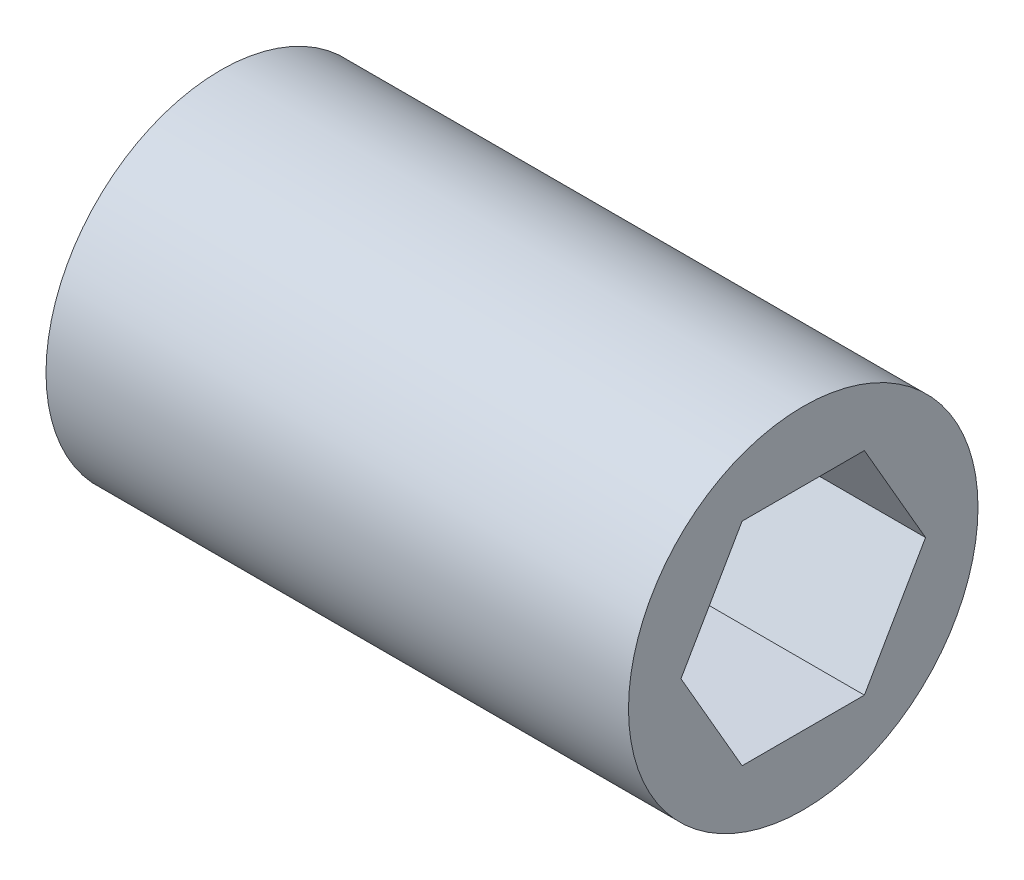
ISO-10303-21;
HEADER;
FILE_DESCRIPTION(('STEP AP214'),'2;1');
FILE_NAME('part.step','',(''),(''),'','','');
FILE_SCHEMA(('AUTOMOTIVE_DESIGN { 1 0 10303 214 1 1 1 1 }'));
ENDSEC;
DATA;
#1=APPLICATION_CONTEXT('core data for automotive mechanical design processes');
#2=APPLICATION_PROTOCOL_DEFINITION('international standard','automotive_design',2000,#1);
#3=PRODUCT_CONTEXT('',#1,'mechanical');
#4=PRODUCT('Part','Part','',(#3));
#5=PRODUCT_RELATED_PRODUCT_CATEGORY('part','',(#4));
#6=PRODUCT_DEFINITION_FORMATION('','',#4);
#7=PRODUCT_DEFINITION_CONTEXT('part definition',#1,'design');
#8=PRODUCT_DEFINITION('design','',#6,#7);
#9=PRODUCT_DEFINITION_SHAPE('','',#8);
#10=(LENGTH_UNIT() NAMED_UNIT(*) SI_UNIT(.MILLI.,.METRE.));
#11=(NAMED_UNIT(*) PLANE_ANGLE_UNIT() SI_UNIT($,.RADIAN.));
#12=(NAMED_UNIT(*) SI_UNIT($,.STERADIAN.) SOLID_ANGLE_UNIT());
#13=UNCERTAINTY_MEASURE_WITH_UNIT(LENGTH_MEASURE(1.E-05),#10,'distance_accuracy_value','');
#14=(GEOMETRIC_REPRESENTATION_CONTEXT(3) GLOBAL_UNCERTAINTY_ASSIGNED_CONTEXT((#13)) GLOBAL_UNIT_ASSIGNED_CONTEXT((#10,
#11,#12)) REPRESENTATION_CONTEXT('',''));
#15=CARTESIAN_POINT('',(0.,0.,0.));
#16=DIRECTION('',(0.,0.,1.));
#17=DIRECTION('',(1.,0.,0.));
#18=AXIS2_PLACEMENT_3D('',#15,#16,#17);
#19=CARTESIAN_POINT('',(17.4625,0.,0.));
#20=DIRECTION('',(1.,0.,0.));
#21=DIRECTION('',(0.,0.,-1.));
#22=AXIS2_PLACEMENT_3D('',#19,#20,#21);
#23=PLANE('',#22);
#24=CARTESIAN_POINT('',(17.4625,0.,0.));
#25=DIRECTION('',(1.,0.,0.));
#26=DIRECTION('',(0.,0.,-1.));
#27=AXIS2_PLACEMENT_3D('',#24,#25,#26);
#28=CIRCLE('',#27,10.4775);
#29=CARTESIAN_POINT('',(17.4625,0.,-10.4775));
#30=VERTEX_POINT('',#29);
#31=EDGE_CURVE('E11',#30,#30,#28,.T.);
#32=ORIENTED_EDGE('',*,*,#31,.T.);
#33=EDGE_LOOP('',(#32));
#34=FACE_BOUND('',#33,.T.);
#35=DIRECTION('',(0.,0.,1.));
#36=VECTOR('',#35,1.);
#37=CARTESIAN_POINT('',(17.4625,6.35,-3.66617420935412));
#38=LINE('',#37,#36);
#39=CARTESIAN_POINT('',(17.4625,6.35,-3.66617420935412));
#40=VERTEX_POINT('',#39);
#41=CARTESIAN_POINT('',(17.4625,6.35,3.66617420935412));
#42=VERTEX_POINT('',#41);
#43=EDGE_CURVE('E95',#40,#42,#38,.T.);
#44=ORIENTED_EDGE('',*,*,#43,.F.);
#45=DIRECTION('',(0.,0.866025403784438,0.5));
#46=VECTOR('',#45,1.);
#47=CARTESIAN_POINT('',(17.4625,0.,-7.33234841870825));
#48=LINE('',#47,#46);
#49=CARTESIAN_POINT('',(17.4625,0.,-7.33234841870825));
#50=VERTEX_POINT('',#49);
#51=EDGE_CURVE('E87',#50,#40,#48,.T.);
#52=ORIENTED_EDGE('',*,*,#51,.F.);
#53=DIRECTION('',(0.,0.866025403784439,-0.5));
#54=VECTOR('',#53,1.);
#55=CARTESIAN_POINT('',(17.4625,-6.35,-3.66617420935412));
#56=LINE('',#55,#54);
#57=CARTESIAN_POINT('',(17.4625,-6.35,-3.66617420935413));
#58=VERTEX_POINT('',#57);
#59=EDGE_CURVE('E115',#58,#50,#56,.T.);
#60=ORIENTED_EDGE('',*,*,#59,.F.);
#61=DIRECTION('',(0.,0.,-1.));
#62=VECTOR('',#61,1.);
#63=CARTESIAN_POINT('',(17.4625,-6.35,3.66617420935412));
#64=LINE('',#63,#62);
#65=CARTESIAN_POINT('',(17.4625,-6.35,3.66617420935412));
#66=VERTEX_POINT('',#65);
#67=EDGE_CURVE('E113',#66,#58,#64,.T.);
#68=ORIENTED_EDGE('',*,*,#67,.F.);
#69=DIRECTION('',(0.,-0.866025403784438,-0.500000000000001));
#70=VECTOR('',#69,1.);
#71=CARTESIAN_POINT('',(17.4625,0.,7.33234841870824));
#72=LINE('',#71,#70);
#73=CARTESIAN_POINT('',(17.4625,0.,7.33234841870824));
#74=VERTEX_POINT('',#73);
#75=EDGE_CURVE('E109',#74,#66,#72,.T.);
#76=ORIENTED_EDGE('',*,*,#75,.F.);
#77=DIRECTION('',(0.,-0.866025403784439,0.5));
#78=VECTOR('',#77,1.);
#79=CARTESIAN_POINT('',(17.4625,6.35,3.66617420935412));
#80=LINE('',#79,#78);
#81=EDGE_CURVE('E107',#42,#74,#80,.T.);
#82=ORIENTED_EDGE('',*,*,#81,.F.);
#83=EDGE_LOOP('',(#44,#52,#60,#68,#76,#82));
#84=FACE_BOUND('',#83,.T.);
#85=ADVANCED_FACE('F34',(#34,#84),#23,.T.);
#86=CARTESIAN_POINT('',(-17.4625,0.,0.));
#87=DIRECTION('',(1.,0.,0.));
#88=DIRECTION('',(0.,0.,-1.));
#89=AXIS2_PLACEMENT_3D('',#86,#87,#88);
#90=PLANE('',#89);
#91=CARTESIAN_POINT('',(-17.4625,0.,0.));
#92=DIRECTION('',(1.,0.,0.));
#93=DIRECTION('',(0.,0.,-1.));
#94=AXIS2_PLACEMENT_3D('',#91,#92,#93);
#95=CIRCLE('',#94,10.4775);
#96=CARTESIAN_POINT('',(-17.4625,0.,-10.4775));
#97=VERTEX_POINT('',#96);
#98=EDGE_CURVE('E38',#97,#97,#95,.T.);
#99=ORIENTED_EDGE('',*,*,#98,.F.);
#100=EDGE_LOOP('',(#99));
#101=FACE_BOUND('',#100,.T.);
#102=DIRECTION('',(0.,0.866025403784438,0.5));
#103=VECTOR('',#102,1.);
#104=CARTESIAN_POINT('',(-17.4625,0.,-7.33234841870825));
#105=LINE('',#104,#103);
#106=CARTESIAN_POINT('',(-17.4625,0.,-7.33234841870824));
#107=VERTEX_POINT('',#106);
#108=CARTESIAN_POINT('',(-17.4625,6.35,-3.66617420935412));
#109=VERTEX_POINT('',#108);
#110=EDGE_CURVE('E57',#107,#109,#105,.T.);
#111=ORIENTED_EDGE('',*,*,#110,.T.);
#112=DIRECTION('',(0.,0.,1.));
#113=VECTOR('',#112,1.);
#114=CARTESIAN_POINT('',(-17.4625,6.35,-3.66617420935412));
#115=LINE('',#114,#113);
#116=CARTESIAN_POINT('',(-17.4625,6.35,3.66617420935412));
#117=VERTEX_POINT('',#116);
#118=EDGE_CURVE('E102',#109,#117,#115,.T.);
#119=ORIENTED_EDGE('',*,*,#118,.T.);
#120=DIRECTION('',(0.,-0.866025403784439,0.5));
#121=VECTOR('',#120,1.);
#122=CARTESIAN_POINT('',(-17.4625,6.35,3.66617420935412));
#123=LINE('',#122,#121);
#124=CARTESIAN_POINT('',(-17.4625,0.,7.33234841870824));
#125=VERTEX_POINT('',#124);
#126=EDGE_CURVE('E119',#117,#125,#123,.T.);
#127=ORIENTED_EDGE('',*,*,#126,.T.);
#128=DIRECTION('',(0.,-0.866025403784438,-0.500000000000001));
#129=VECTOR('',#128,1.);
#130=CARTESIAN_POINT('',(-17.4625,0.,7.33234841870824));
#131=LINE('',#130,#129);
#132=CARTESIAN_POINT('',(-17.4625,-6.35,3.66617420935412));
#133=VERTEX_POINT('',#132);
#134=EDGE_CURVE('E122',#125,#133,#131,.T.);
#135=ORIENTED_EDGE('',*,*,#134,.T.);
#136=DIRECTION('',(0.,0.,-1.));
#137=VECTOR('',#136,1.);
#138=CARTESIAN_POINT('',(-17.4625,-6.35,3.66617420935412));
#139=LINE('',#138,#137);
#140=CARTESIAN_POINT('',(-17.4625,-6.35,-3.66617420935412));
#141=VERTEX_POINT('',#140);
#142=EDGE_CURVE('E125',#133,#141,#139,.T.);
#143=ORIENTED_EDGE('',*,*,#142,.T.);
#144=DIRECTION('',(0.,0.866025403784439,-0.5));
#145=VECTOR('',#144,1.);
#146=CARTESIAN_POINT('',(-17.4625,-6.35,-3.66617420935412));
#147=LINE('',#146,#145);
#148=EDGE_CURVE('E96',#141,#107,#147,.T.);
#149=ORIENTED_EDGE('',*,*,#148,.T.);
#150=EDGE_LOOP('',(#111,#119,#127,#135,#143,#149));
#151=FACE_BOUND('',#150,.T.);
#152=ADVANCED_FACE('F142',(#101,#151),#90,.F.);
#153=CARTESIAN_POINT('',(17.4625,0.,0.));
#154=DIRECTION('',(-1.,0.,0.));
#155=DIRECTION('',(0.,0.,1.));
#156=AXIS2_PLACEMENT_3D('',#153,#154,#155);
#157=CYLINDRICAL_SURFACE('',#156,10.4775);
#158=ORIENTED_EDGE('',*,*,#31,.F.);
#159=EDGE_LOOP('',(#158));
#160=FACE_BOUND('',#159,.T.);
#161=ORIENTED_EDGE('',*,*,#98,.T.);
#162=EDGE_LOOP('',(#161));
#163=FACE_BOUND('',#162,.T.);
#164=ADVANCED_FACE('F36',(#160,#163),#157,.T.);
#165=CARTESIAN_POINT('',(17.4625,0.,-7.33234841870825));
#166=DIRECTION('',(0.,-0.5,0.866025403784438));
#167=DIRECTION('',(0.,-0.866025403784438,-0.5));
#168=AXIS2_PLACEMENT_3D('',#165,#166,#167);
#169=PLANE('',#168);
#170=ORIENTED_EDGE('',*,*,#110,.F.);
#171=DIRECTION('',(-1.,0.,0.));
#172=VECTOR('',#171,1.);
#173=CARTESIAN_POINT('',(17.4625,0.,-7.33234841870825));
#174=LINE('',#173,#172);
#175=EDGE_CURVE('E91',#50,#107,#174,.T.);
#176=ORIENTED_EDGE('',*,*,#175,.F.);
#177=ORIENTED_EDGE('',*,*,#51,.T.);
#178=DIRECTION('',(-1.,0.,0.));
#179=VECTOR('',#178,1.);
#180=CARTESIAN_POINT('',(17.4625,6.35,-3.66617420935412));
#181=LINE('',#180,#179);
#182=EDGE_CURVE('E90',#40,#109,#181,.T.);
#183=ORIENTED_EDGE('',*,*,#182,.T.);
#184=EDGE_LOOP('',(#170,#176,#177,#183));
#185=FACE_BOUND('',#184,.T.);
#186=ADVANCED_FACE('F89',(#185),#169,.T.);
#187=CARTESIAN_POINT('',(17.4625,6.35,-3.66617420935412));
#188=DIRECTION('',(0.,-1.,0.));
#189=DIRECTION('',(0.,0.,-1.));
#190=AXIS2_PLACEMENT_3D('',#187,#188,#189);
#191=PLANE('',#190);
#192=ORIENTED_EDGE('',*,*,#118,.F.);
#193=ORIENTED_EDGE('',*,*,#182,.F.);
#194=ORIENTED_EDGE('',*,*,#43,.T.);
#195=DIRECTION('',(-1.,0.,0.));
#196=VECTOR('',#195,1.);
#197=CARTESIAN_POINT('',(17.4625,6.35,3.66617420935412));
#198=LINE('',#197,#196);
#199=EDGE_CURVE('E103',#42,#117,#198,.T.);
#200=ORIENTED_EDGE('',*,*,#199,.T.);
#201=EDGE_LOOP('',(#192,#193,#194,#200));
#202=FACE_BOUND('',#201,.T.);
#203=ADVANCED_FACE('F99',(#202),#191,.T.);
#204=CARTESIAN_POINT('',(17.4625,6.35,3.66617420935412));
#205=DIRECTION('',(0.,-0.5,-0.866025403784439));
#206=DIRECTION('',(0.,0.866025403784439,-0.5));
#207=AXIS2_PLACEMENT_3D('',#204,#205,#206);
#208=PLANE('',#207);
#209=ORIENTED_EDGE('',*,*,#126,.F.);
#210=ORIENTED_EDGE('',*,*,#199,.F.);
#211=ORIENTED_EDGE('',*,*,#81,.T.);
#212=DIRECTION('',(-1.,0.,0.));
#213=VECTOR('',#212,1.);
#214=CARTESIAN_POINT('',(17.4625,0.,7.33234841870824));
#215=LINE('',#214,#213);
#216=EDGE_CURVE('E134',#74,#125,#215,.T.);
#217=ORIENTED_EDGE('',*,*,#216,.T.);
#218=EDGE_LOOP('',(#209,#210,#211,#217));
#219=FACE_BOUND('',#218,.T.);
#220=ADVANCED_FACE('F138',(#219),#208,.T.);
#221=CARTESIAN_POINT('',(17.4625,0.,7.33234841870824));
#222=DIRECTION('',(0.,0.500000000000001,-0.866025403784438));
#223=DIRECTION('',(0.,0.866025403784438,0.500000000000001));
#224=AXIS2_PLACEMENT_3D('',#221,#222,#223);
#225=PLANE('',#224);
#226=ORIENTED_EDGE('',*,*,#134,.F.);
#227=ORIENTED_EDGE('',*,*,#216,.F.);
#228=ORIENTED_EDGE('',*,*,#75,.T.);
#229=DIRECTION('',(-1.,0.,0.));
#230=VECTOR('',#229,1.);
#231=CARTESIAN_POINT('',(17.4625,-6.35,3.66617420935412));
#232=LINE('',#231,#230);
#233=EDGE_CURVE('E132',#66,#133,#232,.T.);
#234=ORIENTED_EDGE('',*,*,#233,.T.);
#235=EDGE_LOOP('',(#226,#227,#228,#234));
#236=FACE_BOUND('',#235,.T.);
#237=ADVANCED_FACE('F150',(#236),#225,.T.);
#238=CARTESIAN_POINT('',(17.4625,-6.35,3.66617420935412));
#239=DIRECTION('',(0.,1.,0.));
#240=DIRECTION('',(0.,0.,1.));
#241=AXIS2_PLACEMENT_3D('',#238,#239,#240);
#242=PLANE('',#241);
#243=ORIENTED_EDGE('',*,*,#142,.F.);
#244=ORIENTED_EDGE('',*,*,#233,.F.);
#245=ORIENTED_EDGE('',*,*,#67,.T.);
#246=DIRECTION('',(-1.,0.,0.));
#247=VECTOR('',#246,1.);
#248=CARTESIAN_POINT('',(17.4625,-6.35,-3.66617420935412));
#249=LINE('',#248,#247);
#250=EDGE_CURVE('E49',#58,#141,#249,.T.);
#251=ORIENTED_EDGE('',*,*,#250,.T.);
#252=EDGE_LOOP('',(#243,#244,#245,#251));
#253=FACE_BOUND('',#252,.T.);
#254=ADVANCED_FACE('F148',(#253),#242,.T.);
#255=CARTESIAN_POINT('',(17.4625,-6.35,-3.66617420935412));
#256=DIRECTION('',(0.,0.5,0.866025403784439));
#257=DIRECTION('',(0.,-0.866025403784439,0.5));
#258=AXIS2_PLACEMENT_3D('',#255,#256,#257);
#259=PLANE('',#258);
#260=ORIENTED_EDGE('',*,*,#148,.F.);
#261=ORIENTED_EDGE('',*,*,#250,.F.);
#262=ORIENTED_EDGE('',*,*,#59,.T.);
#263=ORIENTED_EDGE('',*,*,#175,.T.);
#264=EDGE_LOOP('',(#260,#261,#262,#263));
#265=FACE_BOUND('',#264,.T.);
#266=ADVANCED_FACE('F144',(#265),#259,.T.);
#267=CLOSED_SHELL('',(#85,#152,#164,#186,#203,#220,#237,#254,#266));
#268=MANIFOLD_SOLID_BREP('B2',#267);
#269=ADVANCED_BREP_SHAPE_REPRESENTATION('',(#18,#268),#14);
#270=SHAPE_DEFINITION_REPRESENTATION(#9,#269);
ENDSEC;
END-ISO-10303-21;
